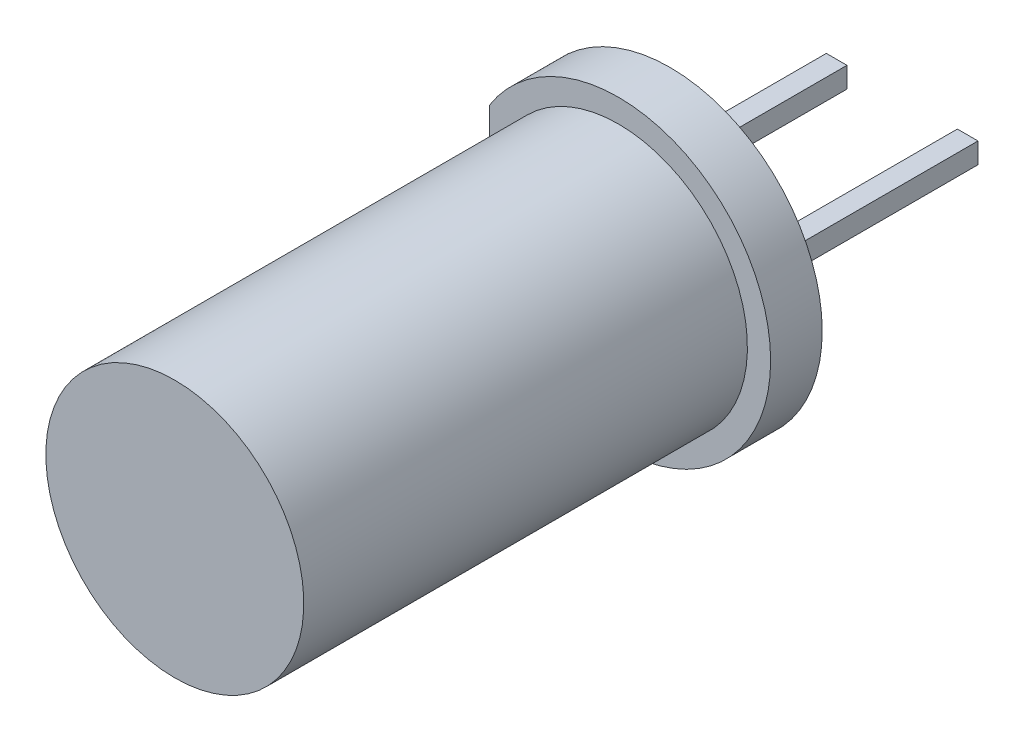
ISO-10303-21;
HEADER;
FILE_DESCRIPTION(('STEP AP214'),'2;1');
FILE_NAME('part.step','',(''),(''),'','','');
FILE_SCHEMA(('AUTOMOTIVE_DESIGN { 1 0 10303 214 1 1 1 1 }'));
ENDSEC;
DATA;
#1=APPLICATION_CONTEXT('core data for automotive mechanical design processes');
#2=APPLICATION_PROTOCOL_DEFINITION('international standard','automotive_design',2000,#1);
#3=PRODUCT_CONTEXT('',#1,'mechanical');
#4=PRODUCT('Part','Part','',(#3));
#5=PRODUCT_RELATED_PRODUCT_CATEGORY('part','',(#4));
#6=PRODUCT_DEFINITION_FORMATION('','',#4);
#7=PRODUCT_DEFINITION_CONTEXT('part definition',#1,'design');
#8=PRODUCT_DEFINITION('design','',#6,#7);
#9=PRODUCT_DEFINITION_SHAPE('','',#8);
#10=(LENGTH_UNIT() NAMED_UNIT(*) SI_UNIT(.MILLI.,.METRE.));
#11=(NAMED_UNIT(*) PLANE_ANGLE_UNIT() SI_UNIT($,.RADIAN.));
#12=(NAMED_UNIT(*) SI_UNIT($,.STERADIAN.) SOLID_ANGLE_UNIT());
#13=UNCERTAINTY_MEASURE_WITH_UNIT(LENGTH_MEASURE(1.E-05),#10,'distance_accuracy_value','');
#14=(GEOMETRIC_REPRESENTATION_CONTEXT(3) GLOBAL_UNCERTAINTY_ASSIGNED_CONTEXT((#13)) GLOBAL_UNIT_ASSIGNED_CONTEXT((#10,
#11,#12)) REPRESENTATION_CONTEXT('',''));
#15=CARTESIAN_POINT('',(0.,0.,0.));
#16=DIRECTION('',(0.,0.,1.));
#17=DIRECTION('',(1.,0.,0.));
#18=AXIS2_PLACEMENT_3D('',#15,#16,#17);
#19=CARTESIAN_POINT('',(1.27,0.,12.6));
#20=DIRECTION('',(0.,0.,-1.));
#21=DIRECTION('',(0.,1.,0.));
#22=AXIS2_PLACEMENT_3D('',#19,#20,#21);
#23=CYLINDRICAL_SURFACE('',#22,2.5);
#24=CARTESIAN_POINT('',(1.27,0.,12.6));
#25=DIRECTION('',(0.,0.,-1.));
#26=DIRECTION('',(0.,1.,0.));
#27=AXIS2_PLACEMENT_3D('',#24,#25,#26);
#28=CIRCLE('',#27,2.5);
#29=CARTESIAN_POINT('',(1.27,2.50000000000001,12.6));
#30=VERTEX_POINT('',#29);
#31=EDGE_CURVE('E99',#30,#30,#28,.T.);
#32=ORIENTED_EDGE('',*,*,#31,.T.);
#33=EDGE_LOOP('',(#32));
#34=FACE_BOUND('',#33,.T.);
#35=CARTESIAN_POINT('',(1.27,0.,4.));
#36=DIRECTION('',(0.,0.,-1.));
#37=DIRECTION('',(0.,1.,0.));
#38=AXIS2_PLACEMENT_3D('',#35,#36,#37);
#39=CIRCLE('',#38,2.5);
#40=CARTESIAN_POINT('',(-1.23,0.,4.));
#41=VERTEX_POINT('',#40);
#42=EDGE_CURVE('E20',#41,#41,#39,.T.);
#43=ORIENTED_EDGE('',*,*,#42,.F.);
#44=EDGE_LOOP('',(#43));
#45=FACE_BOUND('',#44,.T.);
#46=ADVANCED_FACE('F16',(#34,#45),#23,.T.);
#47=CARTESIAN_POINT('',(1.27,0.,12.6));
#48=DIRECTION('',(0.,0.,-1.));
#49=DIRECTION('',(0.,1.,0.));
#50=AXIS2_PLACEMENT_3D('',#47,#48,#49);
#51=PLANE('',#50);
#52=ORIENTED_EDGE('',*,*,#31,.F.);
#53=EDGE_LOOP('',(#52));
#54=FACE_BOUND('',#53,.T.);
#55=ADVANCED_FACE('F18',(#54),#51,.F.);
#56=CARTESIAN_POINT('',(1.27,0.,3.));
#57=DIRECTION('',(0.,0.,-1.));
#58=DIRECTION('',(-1.,0.,0.));
#59=AXIS2_PLACEMENT_3D('',#56,#57,#58);
#60=CYLINDRICAL_SURFACE('',#59,2.95);
#61=CARTESIAN_POINT('',(1.27,0.,4.));
#62=DIRECTION('',(0.,0.,-1.));
#63=DIRECTION('',(-1.,0.,0.));
#64=AXIS2_PLACEMENT_3D('',#61,#62,#63);
#65=CIRCLE('',#64,2.95);
#66=CARTESIAN_POINT('',(-1.22999999999995,1.56604597633687,4.));
#67=VERTEX_POINT('',#66);
#68=CARTESIAN_POINT('',(-1.23,-1.5660459763369,4.));
#69=VERTEX_POINT('',#68);
#70=EDGE_CURVE('E10',#67,#69,#65,.T.);
#71=ORIENTED_EDGE('',*,*,#70,.T.);
#72=DIRECTION('',(0.,0.,1.));
#73=VECTOR('',#72,1.);
#74=CARTESIAN_POINT('',(-1.23,-1.566045976337,3.));
#75=LINE('',#74,#73);
#76=CARTESIAN_POINT('',(-1.23,-1.56604597633679,3.));
#77=VERTEX_POINT('',#76);
#78=EDGE_CURVE('E91',#77,#69,#75,.T.);
#79=ORIENTED_EDGE('',*,*,#78,.F.);
#80=CARTESIAN_POINT('',(1.27,0.,3.));
#81=DIRECTION('',(0.,0.,-1.));
#82=DIRECTION('',(-1.,0.,0.));
#83=AXIS2_PLACEMENT_3D('',#80,#81,#82);
#84=CIRCLE('',#83,2.95);
#85=CARTESIAN_POINT('',(-1.23,1.56604597633679,3.));
#86=VERTEX_POINT('',#85);
#87=EDGE_CURVE('E95',#77,#86,#84,.F.);
#88=ORIENTED_EDGE('',*,*,#87,.T.);
#89=DIRECTION('',(0.,0.,1.));
#90=VECTOR('',#89,1.);
#91=CARTESIAN_POINT('',(-1.23,1.566045976337,3.));
#92=LINE('',#91,#90);
#93=EDGE_CURVE('E105',#67,#86,#92,.F.);
#94=ORIENTED_EDGE('',*,*,#93,.F.);
#95=EDGE_LOOP('',(#71,#79,#88,#94));
#96=FACE_BOUND('',#95,.T.);
#97=ADVANCED_FACE('F93',(#96),#60,.T.);
#98=CARTESIAN_POINT('',(-1.23,-1.566045976337,3.));
#99=DIRECTION('',(-1.,0.,0.));
#100=DIRECTION('',(0.,0.,1.));
#101=AXIS2_PLACEMENT_3D('',#98,#99,#100);
#102=PLANE('',#101);
#103=ORIENTED_EDGE('',*,*,#93,.T.);
#104=DIRECTION('',(0.,1.,0.));
#105=VECTOR('',#104,1.);
#106=CARTESIAN_POINT('',(-1.23,-1.566045976337,3.));
#107=LINE('',#106,#105);
#108=EDGE_CURVE('E104',#77,#86,#107,.T.);
#109=ORIENTED_EDGE('',*,*,#108,.F.);
#110=ORIENTED_EDGE('',*,*,#78,.T.);
#111=CARTESIAN_POINT('',(-1.23,-1.56604597633679,4.));
#112=CARTESIAN_POINT('',(-1.23,1.56604597633679,4.));
#113=B_SPLINE_CURVE_WITH_KNOTS('',1,(#111,#112),.UNSPECIFIED.,.F.,.F.,(2,2),(0.,1.),.UNSPECIFIED.);
#114=EDGE_CURVE('E33',#69,#41,#113,.T.);
#115=ORIENTED_EDGE('',*,*,#114,.T.);
#116=EDGE_CURVE('E26',#41,#67,#113,.T.);
#117=ORIENTED_EDGE('',*,*,#116,.T.);
#118=EDGE_LOOP('',(#103,#109,#110,#115,#117));
#119=FACE_BOUND('',#118,.T.);
#120=ADVANCED_FACE('F107',(#119),#102,.T.);
#121=CARTESIAN_POINT('',(-1.23,-1.566045976337,3.));
#122=DIRECTION('',(0.,0.,-1.));
#123=DIRECTION('',(-1.,0.,0.));
#124=AXIS2_PLACEMENT_3D('',#121,#122,#123);
#125=PLANE('',#124);
#126=DIRECTION('',(0.,1.,0.));
#127=VECTOR('',#126,1.);
#128=CARTESIAN_POINT('',(2.74,0.2,3.));
#129=LINE('',#128,#127);
#130=CARTESIAN_POINT('',(2.74,-0.2,3.));
#131=VERTEX_POINT('',#130);
#132=CARTESIAN_POINT('',(2.74,0.2,3.));
#133=VERTEX_POINT('',#132);
#134=EDGE_CURVE('E109',#131,#133,#129,.T.);
#135=ORIENTED_EDGE('',*,*,#134,.T.);
#136=DIRECTION('',(-1.,0.,0.));
#137=VECTOR('',#136,1.);
#138=CARTESIAN_POINT('',(-1.23,0.2,3.));
#139=LINE('',#138,#137);
#140=CARTESIAN_POINT('',(2.34,0.2,3.));
#141=VERTEX_POINT('',#140);
#142=EDGE_CURVE('E111',#133,#141,#139,.T.);
#143=ORIENTED_EDGE('',*,*,#142,.T.);
#144=DIRECTION('',(0.,1.,0.));
#145=VECTOR('',#144,1.);
#146=CARTESIAN_POINT('',(2.34,-0.2,3.));
#147=LINE('',#146,#145);
#148=CARTESIAN_POINT('',(2.34,-0.2,3.));
#149=VERTEX_POINT('',#148);
#150=EDGE_CURVE('E117',#141,#149,#147,.F.);
#151=ORIENTED_EDGE('',*,*,#150,.T.);
#152=DIRECTION('',(1.,0.,0.));
#153=VECTOR('',#152,1.);
#154=CARTESIAN_POINT('',(2.74,-0.2,3.));
#155=LINE('',#154,#153);
#156=EDGE_CURVE('E119',#149,#131,#155,.T.);
#157=ORIENTED_EDGE('',*,*,#156,.T.);
#158=EDGE_LOOP('',(#135,#143,#151,#157));
#159=FACE_BOUND('',#158,.T.);
#160=DIRECTION('',(1.,0.,0.));
#161=VECTOR('',#160,1.);
#162=CARTESIAN_POINT('',(-0.2,0.2,3.));
#163=LINE('',#162,#161);
#164=CARTESIAN_POINT('',(0.2,0.2,3.));
#165=VERTEX_POINT('',#164);
#166=CARTESIAN_POINT('',(-0.2,0.2,3.));
#167=VERTEX_POINT('',#166);
#168=EDGE_CURVE('E122',#165,#167,#163,.F.);
#169=ORIENTED_EDGE('',*,*,#168,.T.);
#170=DIRECTION('',(0.,1.,0.));
#171=VECTOR('',#170,1.);
#172=CARTESIAN_POINT('',(-0.2,-1.566045976337,3.));
#173=LINE('',#172,#171);
#174=CARTESIAN_POINT('',(-0.2,-0.2,3.));
#175=VERTEX_POINT('',#174);
#176=EDGE_CURVE('E124',#167,#175,#173,.F.);
#177=ORIENTED_EDGE('',*,*,#176,.T.);
#178=DIRECTION('',(1.,0.,0.));
#179=VECTOR('',#178,1.);
#180=CARTESIAN_POINT('',(0.2,-0.2,3.));
#181=LINE('',#180,#179);
#182=CARTESIAN_POINT('',(0.2,-0.2,3.));
#183=VERTEX_POINT('',#182);
#184=EDGE_CURVE('E126',#175,#183,#181,.T.);
#185=ORIENTED_EDGE('',*,*,#184,.T.);
#186=DIRECTION('',(0.,1.,0.));
#187=VECTOR('',#186,1.);
#188=CARTESIAN_POINT('',(0.2,0.2,3.));
#189=LINE('',#188,#187);
#190=EDGE_CURVE('E128',#183,#165,#189,.T.);
#191=ORIENTED_EDGE('',*,*,#190,.T.);
#192=EDGE_LOOP('',(#169,#177,#185,#191));
#193=FACE_BOUND('',#192,.T.);
#194=ORIENTED_EDGE('',*,*,#87,.F.);
#195=ORIENTED_EDGE('',*,*,#108,.T.);
#196=EDGE_LOOP('',(#194,#195));
#197=FACE_BOUND('',#196,.T.);
#198=ADVANCED_FACE('F103',(#159,#193,#197),#125,.T.);
#199=CARTESIAN_POINT('',(2.74,0.2,3.5));
#200=DIRECTION('',(-1.,0.,0.));
#201=DIRECTION('',(0.,0.,1.));
#202=AXIS2_PLACEMENT_3D('',#199,#200,#201);
#203=PLANE('',#202);
#204=DIRECTION('',(0.,1.,0.));
#205=VECTOR('',#204,1.);
#206=CARTESIAN_POINT('',(2.74,0.2,-1.5));
#207=LINE('',#206,#205);
#208=CARTESIAN_POINT('',(2.74,0.2,-1.5));
#209=VERTEX_POINT('',#208);
#210=CARTESIAN_POINT('',(2.74,-0.2,-1.5));
#211=VERTEX_POINT('',#210);
#212=EDGE_CURVE('E131',#209,#211,#207,.F.);
#213=ORIENTED_EDGE('',*,*,#212,.F.);
#214=DIRECTION('',(0.,0.,-1.));
#215=VECTOR('',#214,1.);
#216=CARTESIAN_POINT('',(2.74,0.2,3.5));
#217=LINE('',#216,#215);
#218=EDGE_CURVE('E133',#209,#133,#217,.F.);
#219=ORIENTED_EDGE('',*,*,#218,.T.);
#220=ORIENTED_EDGE('',*,*,#134,.F.);
#221=DIRECTION('',(0.,0.,1.));
#222=VECTOR('',#221,1.);
#223=CARTESIAN_POINT('',(2.74,-0.2,3.5));
#224=LINE('',#223,#222);
#225=EDGE_CURVE('E136',#211,#131,#224,.T.);
#226=ORIENTED_EDGE('',*,*,#225,.F.);
#227=EDGE_LOOP('',(#213,#219,#220,#226));
#228=FACE_BOUND('',#227,.T.);
#229=ADVANCED_FACE('F204',(#228),#203,.F.);
#230=CARTESIAN_POINT('',(2.34,0.2,3.5));
#231=DIRECTION('',(0.,-1.,0.));
#232=DIRECTION('',(0.,0.,-1.));
#233=AXIS2_PLACEMENT_3D('',#230,#231,#232);
#234=PLANE('',#233);
#235=DIRECTION('',(1.,0.,0.));
#236=VECTOR('',#235,1.);
#237=CARTESIAN_POINT('',(2.34,0.2,-1.5));
#238=LINE('',#237,#236);
#239=CARTESIAN_POINT('',(2.34,0.2,-1.5));
#240=VERTEX_POINT('',#239);
#241=EDGE_CURVE('E139',#240,#209,#238,.T.);
#242=ORIENTED_EDGE('',*,*,#241,.F.);
#243=DIRECTION('',(0.,0.,-1.));
#244=VECTOR('',#243,1.);
#245=CARTESIAN_POINT('',(2.34,0.2,3.5));
#246=LINE('',#245,#244);
#247=EDGE_CURVE('E142',#141,#240,#246,.T.);
#248=ORIENTED_EDGE('',*,*,#247,.F.);
#249=ORIENTED_EDGE('',*,*,#142,.F.);
#250=ORIENTED_EDGE('',*,*,#218,.F.);
#251=EDGE_LOOP('',(#242,#248,#249,#250));
#252=FACE_BOUND('',#251,.T.);
#253=ADVANCED_FACE('F208',(#252),#234,.F.);
#254=CARTESIAN_POINT('',(2.34,-0.2,3.5));
#255=DIRECTION('',(1.,0.,0.));
#256=DIRECTION('',(0.,0.,-1.));
#257=AXIS2_PLACEMENT_3D('',#254,#255,#256);
#258=PLANE('',#257);
#259=DIRECTION('',(0.,1.,0.));
#260=VECTOR('',#259,1.);
#261=CARTESIAN_POINT('',(2.34,0.2,-1.5));
#262=LINE('',#261,#260);
#263=CARTESIAN_POINT('',(2.34,-0.2,-1.5));
#264=VERTEX_POINT('',#263);
#265=EDGE_CURVE('E145',#240,#264,#262,.F.);
#266=ORIENTED_EDGE('',*,*,#265,.T.);
#267=DIRECTION('',(0.,0.,-1.));
#268=VECTOR('',#267,1.);
#269=CARTESIAN_POINT('',(2.34,-0.2,3.5));
#270=LINE('',#269,#268);
#271=EDGE_CURVE('E147',#149,#264,#270,.T.);
#272=ORIENTED_EDGE('',*,*,#271,.F.);
#273=ORIENTED_EDGE('',*,*,#150,.F.);
#274=ORIENTED_EDGE('',*,*,#247,.T.);
#275=EDGE_LOOP('',(#266,#272,#273,#274));
#276=FACE_BOUND('',#275,.T.);
#277=ADVANCED_FACE('F212',(#276),#258,.F.);
#278=CARTESIAN_POINT('',(2.74,-0.2,3.5));
#279=DIRECTION('',(0.,1.,0.));
#280=DIRECTION('',(0.,0.,1.));
#281=AXIS2_PLACEMENT_3D('',#278,#279,#280);
#282=PLANE('',#281);
#283=DIRECTION('',(1.,0.,0.));
#284=VECTOR('',#283,1.);
#285=CARTESIAN_POINT('',(2.34,-0.2,-1.5));
#286=LINE('',#285,#284);
#287=EDGE_CURVE('E150',#264,#211,#286,.T.);
#288=ORIENTED_EDGE('',*,*,#287,.T.);
#289=ORIENTED_EDGE('',*,*,#225,.T.);
#290=ORIENTED_EDGE('',*,*,#156,.F.);
#291=ORIENTED_EDGE('',*,*,#271,.T.);
#292=EDGE_LOOP('',(#288,#289,#290,#291));
#293=FACE_BOUND('',#292,.T.);
#294=ADVANCED_FACE('F216',(#293),#282,.F.);
#295=CARTESIAN_POINT('',(-0.2,0.2,3.5));
#296=DIRECTION('',(0.,-1.,0.));
#297=DIRECTION('',(0.,0.,-1.));
#298=AXIS2_PLACEMENT_3D('',#295,#296,#297);
#299=PLANE('',#298);
#300=DIRECTION('',(1.,0.,0.));
#301=VECTOR('',#300,1.);
#302=CARTESIAN_POINT('',(-0.2,0.2,-1.5));
#303=LINE('',#302,#301);
#304=CARTESIAN_POINT('',(-0.2,0.2,-1.5));
#305=VERTEX_POINT('',#304);
#306=CARTESIAN_POINT('',(0.2,0.2,-1.5));
#307=VERTEX_POINT('',#306);
#308=EDGE_CURVE('E153',#305,#307,#303,.T.);
#309=ORIENTED_EDGE('',*,*,#308,.F.);
#310=DIRECTION('',(0.,0.,-1.));
#311=VECTOR('',#310,1.);
#312=CARTESIAN_POINT('',(-0.2,0.2,3.5));
#313=LINE('',#312,#311);
#314=EDGE_CURVE('E155',#305,#167,#313,.F.);
#315=ORIENTED_EDGE('',*,*,#314,.T.);
#316=ORIENTED_EDGE('',*,*,#168,.F.);
#317=DIRECTION('',(0.,0.,-1.));
#318=VECTOR('',#317,1.);
#319=CARTESIAN_POINT('',(0.2,0.2,3.5));
#320=LINE('',#319,#318);
#321=EDGE_CURVE('E158',#307,#165,#320,.F.);
#322=ORIENTED_EDGE('',*,*,#321,.F.);
#323=EDGE_LOOP('',(#309,#315,#316,#322));
#324=FACE_BOUND('',#323,.T.);
#325=ADVANCED_FACE('F220',(#324),#299,.F.);
#326=CARTESIAN_POINT('',(-0.2,-0.2,3.5));
#327=DIRECTION('',(1.,0.,0.));
#328=DIRECTION('',(0.,0.,-1.));
#329=AXIS2_PLACEMENT_3D('',#326,#327,#328);
#330=PLANE('',#329);
#331=DIRECTION('',(0.,1.,0.));
#332=VECTOR('',#331,1.);
#333=CARTESIAN_POINT('',(-0.2,-0.2,-1.5));
#334=LINE('',#333,#332);
#335=CARTESIAN_POINT('',(-0.2,-0.2,-1.5));
#336=VERTEX_POINT('',#335);
#337=EDGE_CURVE('E161',#336,#305,#334,.T.);
#338=ORIENTED_EDGE('',*,*,#337,.F.);
#339=DIRECTION('',(0.,0.,-1.));
#340=VECTOR('',#339,1.);
#341=CARTESIAN_POINT('',(-0.2,-0.2,3.5));
#342=LINE('',#341,#340);
#343=EDGE_CURVE('E164',#175,#336,#342,.T.);
#344=ORIENTED_EDGE('',*,*,#343,.F.);
#345=ORIENTED_EDGE('',*,*,#176,.F.);
#346=ORIENTED_EDGE('',*,*,#314,.F.);
#347=EDGE_LOOP('',(#338,#344,#345,#346));
#348=FACE_BOUND('',#347,.T.);
#349=ADVANCED_FACE('F224',(#348),#330,.F.);
#350=CARTESIAN_POINT('',(0.2,-0.2,3.5));
#351=DIRECTION('',(0.,1.,0.));
#352=DIRECTION('',(0.,0.,1.));
#353=AXIS2_PLACEMENT_3D('',#350,#351,#352);
#354=PLANE('',#353);
#355=DIRECTION('',(1.,0.,0.));
#356=VECTOR('',#355,1.);
#357=CARTESIAN_POINT('',(-0.2,-0.2,-1.5));
#358=LINE('',#357,#356);
#359=CARTESIAN_POINT('',(0.2,-0.2,-1.5));
#360=VERTEX_POINT('',#359);
#361=EDGE_CURVE('E167',#336,#360,#358,.T.);
#362=ORIENTED_EDGE('',*,*,#361,.T.);
#363=DIRECTION('',(0.,0.,1.));
#364=VECTOR('',#363,1.);
#365=CARTESIAN_POINT('',(0.2,-0.2,3.5));
#366=LINE('',#365,#364);
#367=EDGE_CURVE('E169',#183,#360,#366,.F.);
#368=ORIENTED_EDGE('',*,*,#367,.F.);
#369=ORIENTED_EDGE('',*,*,#184,.F.);
#370=ORIENTED_EDGE('',*,*,#343,.T.);
#371=EDGE_LOOP('',(#362,#368,#369,#370));
#372=FACE_BOUND('',#371,.T.);
#373=ADVANCED_FACE('F228',(#372),#354,.F.);
#374=CARTESIAN_POINT('',(0.2,0.2,3.5));
#375=DIRECTION('',(-1.,0.,0.));
#376=DIRECTION('',(0.,0.,1.));
#377=AXIS2_PLACEMENT_3D('',#374,#375,#376);
#378=PLANE('',#377);
#379=DIRECTION('',(0.,1.,0.));
#380=VECTOR('',#379,1.);
#381=CARTESIAN_POINT('',(0.2,0.2,-1.5));
#382=LINE('',#381,#380);
#383=EDGE_CURVE('E172',#360,#307,#382,.T.);
#384=ORIENTED_EDGE('',*,*,#383,.T.);
#385=ORIENTED_EDGE('',*,*,#321,.T.);
#386=ORIENTED_EDGE('',*,*,#190,.F.);
#387=ORIENTED_EDGE('',*,*,#367,.T.);
#388=EDGE_LOOP('',(#384,#385,#386,#387));
#389=FACE_BOUND('',#388,.T.);
#390=ADVANCED_FACE('F232',(#389),#378,.F.);
#391=CARTESIAN_POINT('',(-0.2,0.2,-1.5));
#392=DIRECTION('',(0.,0.,1.));
#393=DIRECTION('',(1.,0.,0.));
#394=AXIS2_PLACEMENT_3D('',#391,#392,#393);
#395=PLANE('',#394);
#396=ORIENTED_EDGE('',*,*,#383,.F.);
#397=ORIENTED_EDGE('',*,*,#361,.F.);
#398=ORIENTED_EDGE('',*,*,#337,.T.);
#399=ORIENTED_EDGE('',*,*,#308,.T.);
#400=EDGE_LOOP('',(#396,#397,#398,#399));
#401=FACE_BOUND('',#400,.T.);
#402=ADVANCED_FACE('F196',(#401),#395,.F.);
#403=CARTESIAN_POINT('',(2.34,0.2,-1.5));
#404=DIRECTION('',(0.,0.,1.));
#405=DIRECTION('',(1.,0.,0.));
#406=AXIS2_PLACEMENT_3D('',#403,#404,#405);
#407=PLANE('',#406);
#408=ORIENTED_EDGE('',*,*,#212,.T.);
#409=ORIENTED_EDGE('',*,*,#287,.F.);
#410=ORIENTED_EDGE('',*,*,#265,.F.);
#411=ORIENTED_EDGE('',*,*,#241,.T.);
#412=EDGE_LOOP('',(#408,#409,#410,#411));
#413=FACE_BOUND('',#412,.T.);
#414=ADVANCED_FACE('F189',(#413),#407,.F.);
#415=CARTESIAN_POINT('',(-1.23,-1.566045976337,4.));
#416=DIRECTION('',(0.,0.,-1.));
#417=DIRECTION('',(-1.,0.,0.));
#418=AXIS2_PLACEMENT_3D('',#415,#416,#417);
#419=PLANE('',#418);
#420=ORIENTED_EDGE('',*,*,#114,.F.);
#421=ORIENTED_EDGE('',*,*,#70,.F.);
#422=ORIENTED_EDGE('',*,*,#116,.F.);
#423=ORIENTED_EDGE('',*,*,#42,.T.);
#424=EDGE_LOOP('',(#420,#421,#422,#423));
#425=FACE_BOUND('',#424,.T.);
#426=ADVANCED_FACE('F187',(#425),#419,.F.);
#427=CLOSED_SHELL('',(#46,#55,#97,#120,#198,#229,#253,#277,#294,#325,#349,#373,#390,#402,#414,#426));
#428=MANIFOLD_SOLID_BREP('B1',#427);
#429=ADVANCED_BREP_SHAPE_REPRESENTATION('',(#18,#428),#14);
#430=SHAPE_DEFINITION_REPRESENTATION(#9,#429);
ENDSEC;
END-ISO-10303-21;
